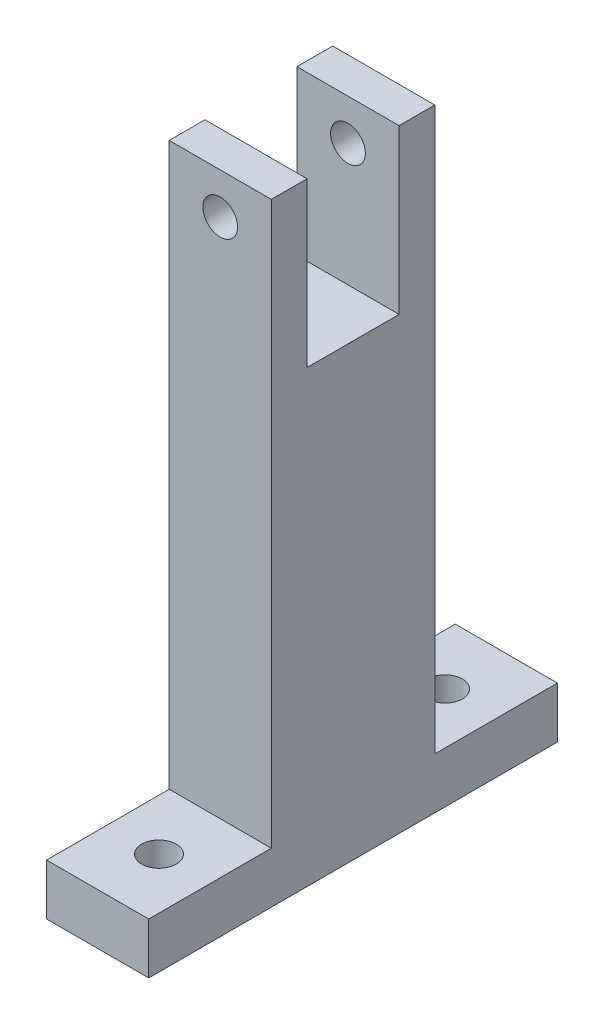
ISO-10303-21;
HEADER;
FILE_DESCRIPTION(('STEP AP214'),'2;1');
FILE_NAME('part.step','',(''),(''),'','','');
FILE_SCHEMA(('AUTOMOTIVE_DESIGN { 1 0 10303 214 1 1 1 1 }'));
ENDSEC;
DATA;
#1=APPLICATION_CONTEXT('core data for automotive mechanical design processes');
#2=APPLICATION_PROTOCOL_DEFINITION('international standard','automotive_design',2000,#1);
#3=PRODUCT_CONTEXT('',#1,'mechanical');
#4=PRODUCT('Part','Part','',(#3));
#5=PRODUCT_RELATED_PRODUCT_CATEGORY('part','',(#4));
#6=PRODUCT_DEFINITION_FORMATION('','',#4);
#7=PRODUCT_DEFINITION_CONTEXT('part definition',#1,'design');
#8=PRODUCT_DEFINITION('design','',#6,#7);
#9=PRODUCT_DEFINITION_SHAPE('','',#8);
#10=(LENGTH_UNIT() NAMED_UNIT(*) SI_UNIT(.MILLI.,.METRE.));
#11=(NAMED_UNIT(*) PLANE_ANGLE_UNIT() SI_UNIT($,.RADIAN.));
#12=(NAMED_UNIT(*) SI_UNIT($,.STERADIAN.) SOLID_ANGLE_UNIT());
#13=UNCERTAINTY_MEASURE_WITH_UNIT(LENGTH_MEASURE(1.E-05),#10,'distance_accuracy_value','');
#14=(GEOMETRIC_REPRESENTATION_CONTEXT(3) GLOBAL_UNCERTAINTY_ASSIGNED_CONTEXT((#13)) GLOBAL_UNIT_ASSIGNED_CONTEXT((#10,
#11,#12)) REPRESENTATION_CONTEXT('',''));
#15=CARTESIAN_POINT('',(0.,0.,0.));
#16=DIRECTION('',(0.,0.,1.));
#17=DIRECTION('',(1.,0.,0.));
#18=AXIS2_PLACEMENT_3D('',#15,#16,#17);
#19=CARTESIAN_POINT('',(10.,60.,16.));
#20=DIRECTION('',(0.,-1.,0.));
#21=DIRECTION('',(0.,0.,-1.));
#22=AXIS2_PLACEMENT_3D('',#19,#20,#21);
#23=PLANE('',#22);
#24=DIRECTION('',(0.,0.,-1.));
#25=VECTOR('',#24,1.);
#26=CARTESIAN_POINT('',(10.,60.,16.));
#27=LINE('',#26,#25);
#28=CARTESIAN_POINT('',(10.,60.,16.));
#29=VERTEX_POINT('',#28);
#30=CARTESIAN_POINT('',(10.,60.,12.5));
#31=VERTEX_POINT('',#30);
#32=EDGE_CURVE('E208',#29,#31,#27,.T.);
#33=ORIENTED_EDGE('',*,*,#32,.T.);
#34=DIRECTION('',(-1.,0.,0.));
#35=VECTOR('',#34,1.);
#36=CARTESIAN_POINT('',(10.,60.,12.5));
#37=LINE('',#36,#35);
#38=CARTESIAN_POINT('',(0.,60.,12.5));
#39=VERTEX_POINT('',#38);
#40=EDGE_CURVE('E11',#31,#39,#37,.T.);
#41=ORIENTED_EDGE('',*,*,#40,.T.);
#42=DIRECTION('',(0.,0.,-1.));
#43=VECTOR('',#42,1.);
#44=CARTESIAN_POINT('',(0.,60.,16.));
#45=LINE('',#44,#43);
#46=CARTESIAN_POINT('',(0.,60.,16.));
#47=VERTEX_POINT('',#46);
#48=EDGE_CURVE('E204',#47,#39,#45,.T.);
#49=ORIENTED_EDGE('',*,*,#48,.F.);
#50=DIRECTION('',(-1.,0.,0.));
#51=VECTOR('',#50,1.);
#52=CARTESIAN_POINT('',(10.,60.,16.));
#53=LINE('',#52,#51);
#54=EDGE_CURVE('E194',#29,#47,#53,.T.);
#55=ORIENTED_EDGE('',*,*,#54,.F.);
#56=EDGE_LOOP('',(#33,#41,#49,#55));
#57=FACE_BOUND('',#56,.T.);
#58=ADVANCED_FACE('F33',(#57),#23,.F.);
#59=CARTESIAN_POINT('',(0.,60.,16.));
#60=DIRECTION('',(1.,0.,0.));
#61=DIRECTION('',(0.,0.,-1.));
#62=AXIS2_PLACEMENT_3D('',#59,#60,#61);
#63=PLANE('',#62);
#64=ORIENTED_EDGE('',*,*,#48,.T.);
#65=DIRECTION('',(0.,-1.,0.));
#66=VECTOR('',#65,1.);
#67=CARTESIAN_POINT('',(0.,60.,12.5));
#68=LINE('',#67,#66);
#69=CARTESIAN_POINT('',(0.,44.,12.5));
#70=VERTEX_POINT('',#69);
#71=EDGE_CURVE('E154',#39,#70,#68,.T.);
#72=ORIENTED_EDGE('',*,*,#71,.T.);
#73=DIRECTION('',(0.,0.,-1.));
#74=VECTOR('',#73,1.);
#75=CARTESIAN_POINT('',(0.,44.,16.));
#76=LINE('',#75,#74);
#77=CARTESIAN_POINT('',(0.,44.,3.5));
#78=VERTEX_POINT('',#77);
#79=EDGE_CURVE('E131',#70,#78,#76,.T.);
#80=ORIENTED_EDGE('',*,*,#79,.T.);
#81=DIRECTION('',(0.,1.,0.));
#82=VECTOR('',#81,1.);
#83=CARTESIAN_POINT('',(0.,60.,3.5));
#84=LINE('',#83,#82);
#85=CARTESIAN_POINT('',(0.,60.,3.5));
#86=VERTEX_POINT('',#85);
#87=EDGE_CURVE('E150',#78,#86,#84,.T.);
#88=ORIENTED_EDGE('',*,*,#87,.T.);
#89=CARTESIAN_POINT('',(0.,60.,0.));
#90=VERTEX_POINT('',#89);
#91=EDGE_CURVE('E196',#86,#90,#45,.T.);
#92=ORIENTED_EDGE('',*,*,#91,.T.);
#93=DIRECTION('',(0.,-1.,0.));
#94=VECTOR('',#93,1.);
#95=CARTESIAN_POINT('',(0.,60.,0.));
#96=LINE('',#95,#94);
#97=CARTESIAN_POINT('',(0.,5.,0.));
#98=VERTEX_POINT('',#97);
#99=EDGE_CURVE('E189',#90,#98,#96,.T.);
#100=ORIENTED_EDGE('',*,*,#99,.T.);
#101=DIRECTION('',(0.,0.,1.));
#102=VECTOR('',#101,1.);
#103=CARTESIAN_POINT('',(0.,5.,-12.));
#104=LINE('',#103,#102);
#105=CARTESIAN_POINT('',(0.,5.,-12.));
#106=VERTEX_POINT('',#105);
#107=EDGE_CURVE('E182',#106,#98,#104,.T.);
#108=ORIENTED_EDGE('',*,*,#107,.F.);
#109=DIRECTION('',(0.,-1.,0.));
#110=VECTOR('',#109,1.);
#111=CARTESIAN_POINT('',(0.,0.,-12.));
#112=LINE('',#111,#110);
#113=CARTESIAN_POINT('',(0.,0.,-12.));
#114=VERTEX_POINT('',#113);
#115=EDGE_CURVE('E178',#106,#114,#112,.T.);
#116=ORIENTED_EDGE('',*,*,#115,.T.);
#117=DIRECTION('',(0.,0.,-1.));
#118=VECTOR('',#117,1.);
#119=CARTESIAN_POINT('',(0.,0.,16.));
#120=LINE('',#119,#118);
#121=CARTESIAN_POINT('',(0.,0.,28.));
#122=VERTEX_POINT('',#121);
#123=EDGE_CURVE('E212',#122,#114,#120,.T.);
#124=ORIENTED_EDGE('',*,*,#123,.F.);
#125=DIRECTION('',(0.,-1.,0.));
#126=VECTOR('',#125,1.);
#127=CARTESIAN_POINT('',(0.,0.,28.));
#128=LINE('',#127,#126);
#129=CARTESIAN_POINT('',(0.,5.,28.));
#130=VERTEX_POINT('',#129);
#131=EDGE_CURVE('E166',#130,#122,#128,.T.);
#132=ORIENTED_EDGE('',*,*,#131,.F.);
#133=CARTESIAN_POINT('',(0.,5.,16.));
#134=VERTEX_POINT('',#133);
#135=EDGE_CURVE('E185',#134,#130,#104,.T.);
#136=ORIENTED_EDGE('',*,*,#135,.F.);
#137=DIRECTION('',(0.,-1.,0.));
#138=VECTOR('',#137,1.);
#139=CARTESIAN_POINT('',(0.,60.,16.));
#140=LINE('',#139,#138);
#141=EDGE_CURVE('E57',#47,#134,#140,.T.);
#142=ORIENTED_EDGE('',*,*,#141,.F.);
#143=EDGE_LOOP('',(#64,#72,#80,#88,#92,#100,#108,#116,#124,#132,#136,#142));
#144=FACE_BOUND('',#143,.T.);
#145=ADVANCED_FACE('F35',(#144),#63,.F.);
#146=CARTESIAN_POINT('',(0.,0.,16.));
#147=DIRECTION('',(0.,1.,0.));
#148=DIRECTION('',(0.,0.,1.));
#149=AXIS2_PLACEMENT_3D('',#146,#147,#148);
#150=PLANE('',#149);
#151=CARTESIAN_POINT('',(5.,0.,22.));
#152=DIRECTION('',(0.,1.,0.));
#153=DIRECTION('',(0.,0.,1.));
#154=AXIS2_PLACEMENT_3D('',#151,#152,#153);
#155=CIRCLE('',#154,1.7);
#156=CARTESIAN_POINT('',(5.,0.,23.7));
#157=VERTEX_POINT('',#156);
#158=EDGE_CURVE('E269',#157,#157,#155,.T.);
#159=ORIENTED_EDGE('',*,*,#158,.T.);
#160=EDGE_LOOP('',(#159));
#161=FACE_BOUND('',#160,.T.);
#162=CARTESIAN_POINT('',(5.,0.,-6.));
#163=DIRECTION('',(0.,1.,0.));
#164=DIRECTION('',(0.,0.,1.));
#165=AXIS2_PLACEMENT_3D('',#162,#163,#164);
#166=CIRCLE('',#165,1.7);
#167=CARTESIAN_POINT('',(5.,0.,-4.3));
#168=VERTEX_POINT('',#167);
#169=EDGE_CURVE('E273',#168,#168,#166,.T.);
#170=ORIENTED_EDGE('',*,*,#169,.T.);
#171=EDGE_LOOP('',(#170));
#172=FACE_BOUND('',#171,.T.);
#173=ORIENTED_EDGE('',*,*,#123,.T.);
#174=DIRECTION('',(1.,0.,0.));
#175=VECTOR('',#174,1.);
#176=CARTESIAN_POINT('',(10.,0.,-12.));
#177=LINE('',#176,#175);
#178=CARTESIAN_POINT('',(10.,0.,-12.));
#179=VERTEX_POINT('',#178);
#180=EDGE_CURVE('E169',#114,#179,#177,.T.);
#181=ORIENTED_EDGE('',*,*,#180,.T.);
#182=DIRECTION('',(0.,0.,-1.));
#183=VECTOR('',#182,1.);
#184=CARTESIAN_POINT('',(10.,0.,16.));
#185=LINE('',#184,#183);
#186=CARTESIAN_POINT('',(10.,0.,28.));
#187=VERTEX_POINT('',#186);
#188=EDGE_CURVE('E210',#187,#179,#185,.T.);
#189=ORIENTED_EDGE('',*,*,#188,.F.);
#190=DIRECTION('',(1.,0.,0.));
#191=VECTOR('',#190,1.);
#192=CARTESIAN_POINT('',(10.,0.,28.));
#193=LINE('',#192,#191);
#194=EDGE_CURVE('E157',#122,#187,#193,.T.);
#195=ORIENTED_EDGE('',*,*,#194,.F.);
#196=EDGE_LOOP('',(#173,#181,#189,#195));
#197=FACE_BOUND('',#196,.T.);
#198=ADVANCED_FACE('F249',(#161,#172,#197),#150,.F.);
#199=CARTESIAN_POINT('',(10.,0.,16.));
#200=DIRECTION('',(-1.,0.,0.));
#201=DIRECTION('',(0.,0.,1.));
#202=AXIS2_PLACEMENT_3D('',#199,#200,#201);
#203=PLANE('',#202);
#204=DIRECTION('',(0.,0.,-1.));
#205=VECTOR('',#204,1.);
#206=CARTESIAN_POINT('',(10.,44.,12.5));
#207=LINE('',#206,#205);
#208=CARTESIAN_POINT('',(10.,44.,12.5));
#209=VERTEX_POINT('',#208);
#210=CARTESIAN_POINT('',(10.,44.,3.5));
#211=VERTEX_POINT('',#210);
#212=EDGE_CURVE('E129',#209,#211,#207,.T.);
#213=ORIENTED_EDGE('',*,*,#212,.F.);
#214=DIRECTION('',(0.,-1.,0.));
#215=VECTOR('',#214,1.);
#216=CARTESIAN_POINT('',(10.,60.,12.5));
#217=LINE('',#216,#215);
#218=EDGE_CURVE('E137',#31,#209,#217,.T.);
#219=ORIENTED_EDGE('',*,*,#218,.F.);
#220=ORIENTED_EDGE('',*,*,#32,.F.);
#221=DIRECTION('',(0.,1.,0.));
#222=VECTOR('',#221,1.);
#223=CARTESIAN_POINT('',(10.,0.,16.));
#224=LINE('',#223,#222);
#225=CARTESIAN_POINT('',(10.,5.,16.));
#226=VERTEX_POINT('',#225);
#227=EDGE_CURVE('E191',#226,#29,#224,.T.);
#228=ORIENTED_EDGE('',*,*,#227,.F.);
#229=DIRECTION('',(0.,0.,1.));
#230=VECTOR('',#229,1.);
#231=CARTESIAN_POINT('',(10.,5.,-12.));
#232=LINE('',#231,#230);
#233=CARTESIAN_POINT('',(10.,5.,28.));
#234=VERTEX_POINT('',#233);
#235=EDGE_CURVE('E181',#226,#234,#232,.T.);
#236=ORIENTED_EDGE('',*,*,#235,.T.);
#237=DIRECTION('',(0.,1.,0.));
#238=VECTOR('',#237,1.);
#239=CARTESIAN_POINT('',(10.,5.,28.));
#240=LINE('',#239,#238);
#241=EDGE_CURVE('E160',#187,#234,#240,.T.);
#242=ORIENTED_EDGE('',*,*,#241,.F.);
#243=ORIENTED_EDGE('',*,*,#188,.T.);
#244=DIRECTION('',(0.,1.,0.));
#245=VECTOR('',#244,1.);
#246=CARTESIAN_POINT('',(10.,5.,-12.));
#247=LINE('',#246,#245);
#248=CARTESIAN_POINT('',(10.,5.,-12.));
#249=VERTEX_POINT('',#248);
#250=EDGE_CURVE('E172',#179,#249,#247,.T.);
#251=ORIENTED_EDGE('',*,*,#250,.T.);
#252=CARTESIAN_POINT('',(10.,5.,0.));
#253=VERTEX_POINT('',#252);
#254=EDGE_CURVE('E186',#249,#253,#232,.T.);
#255=ORIENTED_EDGE('',*,*,#254,.T.);
#256=DIRECTION('',(0.,1.,0.));
#257=VECTOR('',#256,1.);
#258=CARTESIAN_POINT('',(10.,0.,0.));
#259=LINE('',#258,#257);
#260=CARTESIAN_POINT('',(10.,60.,0.));
#261=VERTEX_POINT('',#260);
#262=EDGE_CURVE('E199',#253,#261,#259,.T.);
#263=ORIENTED_EDGE('',*,*,#262,.T.);
#264=CARTESIAN_POINT('',(10.,60.,3.5));
#265=VERTEX_POINT('',#264);
#266=EDGE_CURVE('E207',#265,#261,#27,.T.);
#267=ORIENTED_EDGE('',*,*,#266,.F.);
#268=DIRECTION('',(0.,1.,0.));
#269=VECTOR('',#268,1.);
#270=CARTESIAN_POINT('',(10.,44.,3.5));
#271=LINE('',#270,#269);
#272=EDGE_CURVE('E49',#211,#265,#271,.T.);
#273=ORIENTED_EDGE('',*,*,#272,.F.);
#274=EDGE_LOOP('',(#213,#219,#220,#228,#236,#242,#243,#251,#255,#263,#267,#273));
#275=FACE_BOUND('',#274,.T.);
#276=ADVANCED_FACE('F144',(#275),#203,.F.);
#277=ORIENTED_EDGE('',*,*,#91,.F.);
#278=DIRECTION('',(1.,0.,0.));
#279=VECTOR('',#278,1.);
#280=CARTESIAN_POINT('',(10.,60.,3.5));
#281=LINE('',#280,#279);
#282=EDGE_CURVE('E42',#86,#265,#281,.T.);
#283=ORIENTED_EDGE('',*,*,#282,.T.);
#284=ORIENTED_EDGE('',*,*,#266,.T.);
#285=DIRECTION('',(-1.,0.,0.));
#286=VECTOR('',#285,1.);
#287=CARTESIAN_POINT('',(10.,60.,0.));
#288=LINE('',#287,#286);
#289=EDGE_CURVE('E192',#261,#90,#288,.T.);
#290=ORIENTED_EDGE('',*,*,#289,.T.);
#291=EDGE_LOOP('',(#277,#283,#284,#290));
#292=FACE_BOUND('',#291,.T.);
#293=ADVANCED_FACE('F219',(#292),#23,.F.);
#294=CARTESIAN_POINT('',(0.,0.,16.));
#295=DIRECTION('',(0.,0.,1.));
#296=DIRECTION('',(1.,0.,0.));
#297=AXIS2_PLACEMENT_3D('',#294,#295,#296);
#298=PLANE('',#297);
#299=CARTESIAN_POINT('',(5.,56.,16.));
#300=DIRECTION('',(0.,0.,1.));
#301=DIRECTION('',(1.,0.,0.));
#302=AXIS2_PLACEMENT_3D('',#299,#300,#301);
#303=CIRCLE('',#302,1.7);
#304=CARTESIAN_POINT('',(6.7,56.,16.));
#305=VERTEX_POINT('',#304);
#306=EDGE_CURVE('E316',#305,#305,#303,.T.);
#307=ORIENTED_EDGE('',*,*,#306,.F.);
#308=EDGE_LOOP('',(#307));
#309=FACE_BOUND('',#308,.T.);
#310=DIRECTION('',(-1.,0.,0.));
#311=VECTOR('',#310,1.);
#312=CARTESIAN_POINT('',(0.,5.,16.));
#313=LINE('',#312,#311);
#314=EDGE_CURVE('E184',#226,#134,#313,.T.);
#315=ORIENTED_EDGE('',*,*,#314,.F.);
#316=ORIENTED_EDGE('',*,*,#227,.T.);
#317=ORIENTED_EDGE('',*,*,#54,.T.);
#318=ORIENTED_EDGE('',*,*,#141,.T.);
#319=EDGE_LOOP('',(#315,#316,#317,#318));
#320=FACE_BOUND('',#319,.T.);
#321=ADVANCED_FACE('F253',(#309,#320),#298,.T.);
#322=CARTESIAN_POINT('',(0.,0.,0.));
#323=DIRECTION('',(0.,0.,1.));
#324=DIRECTION('',(1.,0.,0.));
#325=AXIS2_PLACEMENT_3D('',#322,#323,#324);
#326=PLANE('',#325);
#327=CARTESIAN_POINT('',(5.,56.,0.));
#328=DIRECTION('',(0.,0.,1.));
#329=DIRECTION('',(1.,0.,0.));
#330=AXIS2_PLACEMENT_3D('',#327,#328,#329);
#331=CIRCLE('',#330,1.7);
#332=CARTESIAN_POINT('',(6.7,56.,0.));
#333=VERTEX_POINT('',#332);
#334=EDGE_CURVE('E142',#333,#333,#331,.T.);
#335=ORIENTED_EDGE('',*,*,#334,.T.);
#336=EDGE_LOOP('',(#335));
#337=FACE_BOUND('',#336,.T.);
#338=ORIENTED_EDGE('',*,*,#262,.F.);
#339=DIRECTION('',(-1.,0.,0.));
#340=VECTOR('',#339,1.);
#341=CARTESIAN_POINT('',(0.,5.,0.));
#342=LINE('',#341,#340);
#343=EDGE_CURVE('E214',#253,#98,#342,.T.);
#344=ORIENTED_EDGE('',*,*,#343,.T.);
#345=ORIENTED_EDGE('',*,*,#99,.F.);
#346=ORIENTED_EDGE('',*,*,#289,.F.);
#347=EDGE_LOOP('',(#338,#344,#345,#346));
#348=FACE_BOUND('',#347,.T.);
#349=ADVANCED_FACE('F225',(#337,#348),#326,.F.);
#350=CARTESIAN_POINT('',(0.,0.,-12.));
#351=DIRECTION('',(0.,0.,-1.));
#352=DIRECTION('',(-1.,0.,0.));
#353=AXIS2_PLACEMENT_3D('',#350,#351,#352);
#354=PLANE('',#353);
#355=ORIENTED_EDGE('',*,*,#180,.F.);
#356=ORIENTED_EDGE('',*,*,#115,.F.);
#357=DIRECTION('',(-1.,0.,0.));
#358=VECTOR('',#357,1.);
#359=CARTESIAN_POINT('',(0.,5.,-12.));
#360=LINE('',#359,#358);
#361=EDGE_CURVE('E175',#249,#106,#360,.T.);
#362=ORIENTED_EDGE('',*,*,#361,.F.);
#363=ORIENTED_EDGE('',*,*,#250,.F.);
#364=EDGE_LOOP('',(#355,#356,#362,#363));
#365=FACE_BOUND('',#364,.T.);
#366=ADVANCED_FACE('F280',(#365),#354,.T.);
#367=CARTESIAN_POINT('',(0.,5.,-12.));
#368=DIRECTION('',(0.,1.,0.));
#369=DIRECTION('',(0.,0.,1.));
#370=AXIS2_PLACEMENT_3D('',#367,#368,#369);
#371=PLANE('',#370);
#372=CARTESIAN_POINT('',(5.,5.,-6.));
#373=DIRECTION('',(0.,1.,0.));
#374=DIRECTION('',(0.,0.,1.));
#375=AXIS2_PLACEMENT_3D('',#372,#373,#374);
#376=CIRCLE('',#375,1.7);
#377=CARTESIAN_POINT('',(5.,5.,-4.3));
#378=VERTEX_POINT('',#377);
#379=EDGE_CURVE('E320',#378,#378,#376,.T.);
#380=ORIENTED_EDGE('',*,*,#379,.F.);
#381=EDGE_LOOP('',(#380));
#382=FACE_BOUND('',#381,.T.);
#383=ORIENTED_EDGE('',*,*,#343,.F.);
#384=ORIENTED_EDGE('',*,*,#254,.F.);
#385=ORIENTED_EDGE('',*,*,#361,.T.);
#386=ORIENTED_EDGE('',*,*,#107,.T.);
#387=EDGE_LOOP('',(#383,#384,#385,#386));
#388=FACE_BOUND('',#387,.T.);
#389=ADVANCED_FACE('F293',(#382,#388),#371,.T.);
#390=CARTESIAN_POINT('',(5.,5.,22.));
#391=DIRECTION('',(0.,1.,0.));
#392=DIRECTION('',(0.,0.,1.));
#393=AXIS2_PLACEMENT_3D('',#390,#391,#392);
#394=CIRCLE('',#393,1.7);
#395=CARTESIAN_POINT('',(5.,5.,23.7));
#396=VERTEX_POINT('',#395);
#397=EDGE_CURVE('E324',#396,#396,#394,.T.);
#398=ORIENTED_EDGE('',*,*,#397,.F.);
#399=EDGE_LOOP('',(#398));
#400=FACE_BOUND('',#399,.T.);
#401=ORIENTED_EDGE('',*,*,#235,.F.);
#402=ORIENTED_EDGE('',*,*,#314,.T.);
#403=ORIENTED_EDGE('',*,*,#135,.T.);
#404=DIRECTION('',(-1.,0.,0.));
#405=VECTOR('',#404,1.);
#406=CARTESIAN_POINT('',(0.,5.,28.));
#407=LINE('',#406,#405);
#408=EDGE_CURVE('E163',#234,#130,#407,.T.);
#409=ORIENTED_EDGE('',*,*,#408,.F.);
#410=EDGE_LOOP('',(#401,#402,#403,#409));
#411=FACE_BOUND('',#410,.T.);
#412=ADVANCED_FACE('F289',(#400,#411),#371,.T.);
#413=CARTESIAN_POINT('',(0.,0.,28.));
#414=DIRECTION('',(0.,0.,-1.));
#415=DIRECTION('',(-1.,0.,0.));
#416=AXIS2_PLACEMENT_3D('',#413,#414,#415);
#417=PLANE('',#416);
#418=ORIENTED_EDGE('',*,*,#194,.T.);
#419=ORIENTED_EDGE('',*,*,#241,.T.);
#420=ORIENTED_EDGE('',*,*,#408,.T.);
#421=ORIENTED_EDGE('',*,*,#131,.T.);
#422=EDGE_LOOP('',(#418,#419,#420,#421));
#423=FACE_BOUND('',#422,.T.);
#424=ADVANCED_FACE('F286',(#423),#417,.F.);
#425=CARTESIAN_POINT('',(-2.,44.,12.5));
#426=DIRECTION('',(0.,-1.,0.));
#427=DIRECTION('',(0.,0.,-1.));
#428=AXIS2_PLACEMENT_3D('',#425,#426,#427);
#429=PLANE('',#428);
#430=DIRECTION('',(1.,0.,0.));
#431=VECTOR('',#430,1.);
#432=CARTESIAN_POINT('',(-2.,44.,12.5));
#433=LINE('',#432,#431);
#434=EDGE_CURVE('E124',#70,#209,#433,.T.);
#435=ORIENTED_EDGE('',*,*,#434,.T.);
#436=ORIENTED_EDGE('',*,*,#212,.T.);
#437=DIRECTION('',(1.,0.,0.));
#438=VECTOR('',#437,1.);
#439=CARTESIAN_POINT('',(-2.,44.,3.5));
#440=LINE('',#439,#438);
#441=EDGE_CURVE('E134',#78,#211,#440,.T.);
#442=ORIENTED_EDGE('',*,*,#441,.F.);
#443=ORIENTED_EDGE('',*,*,#79,.F.);
#444=EDGE_LOOP('',(#435,#436,#442,#443));
#445=FACE_BOUND('',#444,.T.);
#446=ADVANCED_FACE('F126',(#445),#429,.F.);
#447=CARTESIAN_POINT('',(-2.,60.,12.5));
#448=DIRECTION('',(0.,0.,1.));
#449=DIRECTION('',(0.,-1.,0.));
#450=AXIS2_PLACEMENT_3D('',#447,#448,#449);
#451=PLANE('',#450);
#452=CARTESIAN_POINT('',(5.,56.,12.5));
#453=DIRECTION('',(0.,0.,1.));
#454=DIRECTION('',(0.,-1.,0.));
#455=AXIS2_PLACEMENT_3D('',#452,#453,#454);
#456=CIRCLE('',#455,1.7);
#457=CARTESIAN_POINT('',(5.,54.3,12.5));
#458=VERTEX_POINT('',#457);
#459=EDGE_CURVE('E312',#458,#458,#456,.T.);
#460=ORIENTED_EDGE('',*,*,#459,.T.);
#461=EDGE_LOOP('',(#460));
#462=FACE_BOUND('',#461,.T.);
#463=ORIENTED_EDGE('',*,*,#40,.F.);
#464=ORIENTED_EDGE('',*,*,#218,.T.);
#465=ORIENTED_EDGE('',*,*,#434,.F.);
#466=ORIENTED_EDGE('',*,*,#71,.F.);
#467=EDGE_LOOP('',(#463,#464,#465,#466));
#468=FACE_BOUND('',#467,.T.);
#469=ADVANCED_FACE('F138',(#462,#468),#451,.F.);
#470=CARTESIAN_POINT('',(-2.,44.,3.5));
#471=DIRECTION('',(0.,0.,-1.));
#472=DIRECTION('',(-1.,0.,0.));
#473=AXIS2_PLACEMENT_3D('',#470,#471,#472);
#474=PLANE('',#473);
#475=CARTESIAN_POINT('',(5.,56.,3.5));
#476=DIRECTION('',(0.,0.,-1.));
#477=DIRECTION('',(-1.,0.,0.));
#478=AXIS2_PLACEMENT_3D('',#475,#476,#477);
#479=CIRCLE('',#478,1.7);
#480=CARTESIAN_POINT('',(3.3,56.,3.5));
#481=VERTEX_POINT('',#480);
#482=EDGE_CURVE('E37',#481,#481,#479,.T.);
#483=ORIENTED_EDGE('',*,*,#482,.T.);
#484=EDGE_LOOP('',(#483));
#485=FACE_BOUND('',#484,.T.);
#486=ORIENTED_EDGE('',*,*,#441,.T.);
#487=ORIENTED_EDGE('',*,*,#272,.T.);
#488=ORIENTED_EDGE('',*,*,#282,.F.);
#489=ORIENTED_EDGE('',*,*,#87,.F.);
#490=EDGE_LOOP('',(#486,#487,#488,#489));
#491=FACE_BOUND('',#490,.T.);
#492=ADVANCED_FACE('F227',(#485,#491),#474,.F.);
#493=CARTESIAN_POINT('',(5.,56.,-9.));
#494=DIRECTION('',(0.,0.,1.));
#495=DIRECTION('',(1.,0.,0.));
#496=AXIS2_PLACEMENT_3D('',#493,#494,#495);
#497=CYLINDRICAL_SURFACE('',#496,1.7);
#498=ORIENTED_EDGE('',*,*,#482,.F.);
#499=EDGE_LOOP('',(#498));
#500=FACE_BOUND('',#499,.T.);
#501=ORIENTED_EDGE('',*,*,#334,.F.);
#502=EDGE_LOOP('',(#501));
#503=FACE_BOUND('',#502,.T.);
#504=ADVANCED_FACE('F229',(#500,#503),#497,.F.);
#505=ORIENTED_EDGE('',*,*,#306,.T.);
#506=EDGE_LOOP('',(#505));
#507=FACE_BOUND('',#506,.T.);
#508=ORIENTED_EDGE('',*,*,#459,.F.);
#509=EDGE_LOOP('',(#508));
#510=FACE_BOUND('',#509,.T.);
#511=ADVANCED_FACE('F236',(#507,#510),#497,.F.);
#512=CARTESIAN_POINT('',(5.,-20.,-6.));
#513=DIRECTION('',(0.,1.,0.));
#514=DIRECTION('',(0.,0.,1.));
#515=AXIS2_PLACEMENT_3D('',#512,#513,#514);
#516=CYLINDRICAL_SURFACE('',#515,1.7);
#517=ORIENTED_EDGE('',*,*,#379,.T.);
#518=EDGE_LOOP('',(#517));
#519=FACE_BOUND('',#518,.T.);
#520=ORIENTED_EDGE('',*,*,#169,.F.);
#521=EDGE_LOOP('',(#520));
#522=FACE_BOUND('',#521,.T.);
#523=ADVANCED_FACE('F330',(#519,#522),#516,.F.);
#524=CARTESIAN_POINT('',(5.,-20.,22.));
#525=DIRECTION('',(0.,1.,0.));
#526=DIRECTION('',(0.,0.,1.));
#527=AXIS2_PLACEMENT_3D('',#524,#525,#526);
#528=CYLINDRICAL_SURFACE('',#527,1.7);
#529=ORIENTED_EDGE('',*,*,#397,.T.);
#530=EDGE_LOOP('',(#529));
#531=FACE_BOUND('',#530,.T.);
#532=ORIENTED_EDGE('',*,*,#158,.F.);
#533=EDGE_LOOP('',(#532));
#534=FACE_BOUND('',#533,.T.);
#535=ADVANCED_FACE('F327',(#531,#534),#528,.F.);
#536=CLOSED_SHELL('',(#58,#145,#198,#276,#293,#321,#349,#366,#389,#412,#424,#446,#469,#492,#504,
#511,#523,#535));
#537=MANIFOLD_SOLID_BREP('B2',#536);
#538=ADVANCED_BREP_SHAPE_REPRESENTATION('',(#18,#537),#14);
#539=SHAPE_DEFINITION_REPRESENTATION(#9,#538);
ENDSEC;
END-ISO-10303-21;
